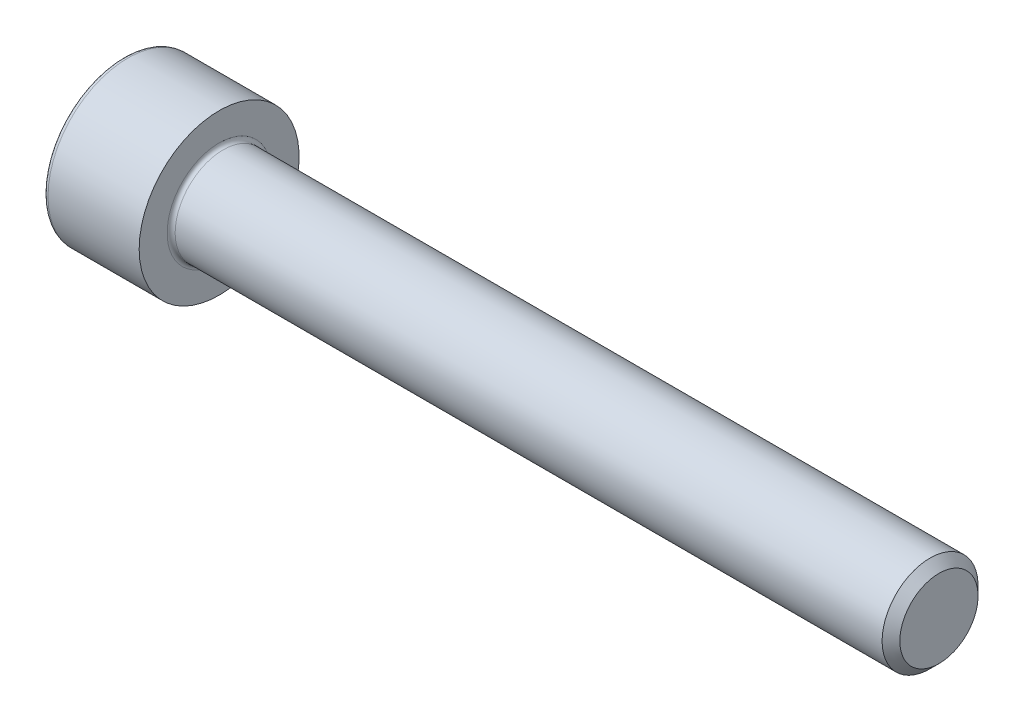
ISO-10303-21;
HEADER;
FILE_DESCRIPTION(('STEP AP214'),'2;1');
FILE_NAME('part.step','',(''),(''),'','','');
FILE_SCHEMA(('AUTOMOTIVE_DESIGN { 1 0 10303 214 1 1 1 1 }'));
ENDSEC;
DATA;
#1=APPLICATION_CONTEXT('core data for automotive mechanical design processes');
#2=APPLICATION_PROTOCOL_DEFINITION('international standard','automotive_design',2000,#1);
#3=PRODUCT_CONTEXT('',#1,'mechanical');
#4=PRODUCT('Part','Part','',(#3));
#5=PRODUCT_RELATED_PRODUCT_CATEGORY('part','',(#4));
#6=PRODUCT_DEFINITION_FORMATION('','',#4);
#7=PRODUCT_DEFINITION_CONTEXT('part definition',#1,'design');
#8=PRODUCT_DEFINITION('design','',#6,#7);
#9=PRODUCT_DEFINITION_SHAPE('','',#8);
#10=(LENGTH_UNIT() NAMED_UNIT(*) SI_UNIT(.MILLI.,.METRE.));
#11=(NAMED_UNIT(*) PLANE_ANGLE_UNIT() SI_UNIT($,.RADIAN.));
#12=(NAMED_UNIT(*) SI_UNIT($,.STERADIAN.) SOLID_ANGLE_UNIT());
#13=UNCERTAINTY_MEASURE_WITH_UNIT(LENGTH_MEASURE(1.E-05),#10,'distance_accuracy_value','');
#14=(GEOMETRIC_REPRESENTATION_CONTEXT(3) GLOBAL_UNCERTAINTY_ASSIGNED_CONTEXT((#13)) GLOBAL_UNIT_ASSIGNED_CONTEXT((#10,
#11,#12)) REPRESENTATION_CONTEXT('',''));
#15=CARTESIAN_POINT('',(0.,0.,0.));
#16=DIRECTION('',(0.,0.,1.));
#17=DIRECTION('',(1.,0.,0.));
#18=AXIS2_PLACEMENT_3D('',#15,#16,#17);
#19=CARTESIAN_POINT('',(0.,0.,0.));
#20=DIRECTION('',(-1.,0.,0.));
#21=DIRECTION('',(0.,0.,1.));
#22=AXIS2_PLACEMENT_3D('',#19,#20,#21);
#23=PLANE('',#22);
#24=DIRECTION('',(0.,-0.499999999999999,0.866025403784439));
#25=VECTOR('',#24,1.);
#26=CARTESIAN_POINT('',(0.,2.93524876856005,0.));
#27=LINE('',#26,#25);
#28=CARTESIAN_POINT('',(0.,2.93524876856005,0.));
#29=VERTEX_POINT('',#28);
#30=CARTESIAN_POINT('',(0.,1.46762438428003,2.54199999999999));
#31=VERTEX_POINT('',#30);
#32=EDGE_CURVE('E259',#29,#31,#27,.T.);
#33=ORIENTED_EDGE('',*,*,#32,.T.);
#34=DIRECTION('',(0.,1.,0.));
#35=VECTOR('',#34,1.);
#36=CARTESIAN_POINT('',(0.,-1.46762438428003,2.542));
#37=LINE('',#36,#35);
#38=CARTESIAN_POINT('',(0.,-1.46762438428003,2.542));
#39=VERTEX_POINT('',#38);
#40=EDGE_CURVE('E131',#39,#31,#37,.T.);
#41=ORIENTED_EDGE('',*,*,#40,.F.);
#42=DIRECTION('',(0.,-0.500000000000001,-0.866025403784438));
#43=VECTOR('',#42,1.);
#44=CARTESIAN_POINT('',(0.,-1.46762438428003,2.542));
#45=LINE('',#44,#43);
#46=CARTESIAN_POINT('',(0.,-2.93524876856006,0.));
#47=VERTEX_POINT('',#46);
#48=EDGE_CURVE('E262',#39,#47,#45,.T.);
#49=ORIENTED_EDGE('',*,*,#48,.T.);
#50=DIRECTION('',(0.,0.499999999999999,-0.866025403784439));
#51=VECTOR('',#50,1.);
#52=CARTESIAN_POINT('',(0.,-2.93524876856006,0.));
#53=LINE('',#52,#51);
#54=CARTESIAN_POINT('',(0.,-1.46762438428004,-2.542));
#55=VERTEX_POINT('',#54);
#56=EDGE_CURVE('E265',#47,#55,#53,.T.);
#57=ORIENTED_EDGE('',*,*,#56,.T.);
#58=DIRECTION('',(0.,-1.,0.));
#59=VECTOR('',#58,1.);
#60=CARTESIAN_POINT('',(0.,1.46762438428002,-2.54200000000001));
#61=LINE('',#60,#59);
#62=CARTESIAN_POINT('',(0.,1.46762438428002,-2.54200000000001));
#63=VERTEX_POINT('',#62);
#64=EDGE_CURVE('E268',#63,#55,#61,.T.);
#65=ORIENTED_EDGE('',*,*,#64,.F.);
#66=DIRECTION('',(0.,-0.500000000000001,-0.866025403784438));
#67=VECTOR('',#66,1.);
#68=CARTESIAN_POINT('',(0.,2.93524876856005,0.));
#69=LINE('',#68,#67);
#70=EDGE_CURVE('E126',#29,#63,#69,.T.);
#71=ORIENTED_EDGE('',*,*,#70,.F.);
#72=EDGE_LOOP('',(#33,#41,#49,#57,#65,#71));
#73=FACE_BOUND('',#72,.T.);
#74=CARTESIAN_POINT('',(0.,0.,0.));
#75=DIRECTION('',(-1.,0.,0.));
#76=DIRECTION('',(0.,0.,1.));
#77=AXIS2_PLACEMENT_3D('',#74,#75,#76);
#78=CIRCLE('',#77,4.7);
#79=CARTESIAN_POINT('',(0.,0.,4.7));
#80=VERTEX_POINT('',#79);
#81=EDGE_CURVE('E43',#80,#80,#78,.T.);
#82=ORIENTED_EDGE('',*,*,#81,.T.);
#83=EDGE_LOOP('',(#82));
#84=FACE_BOUND('',#83,.T.);
#85=ADVANCED_FACE('F35',(#73,#84),#23,.T.);
#86=CARTESIAN_POINT('',(-31.75,0.,0.));
#87=DIRECTION('',(-1.,0.,0.));
#88=DIRECTION('',(0.,0.,1.));
#89=AXIS2_PLACEMENT_3D('',#86,#87,#88);
#90=CYLINDRICAL_SURFACE('',#89,5.);
#91=CARTESIAN_POINT('',(0.300000000000002,0.,0.));
#92=DIRECTION('',(-1.,0.,0.));
#93=DIRECTION('',(0.,0.,1.));
#94=AXIS2_PLACEMENT_3D('',#91,#92,#93);
#95=CIRCLE('',#94,5.);
#96=CARTESIAN_POINT('',(0.300000000000002,0.,5.));
#97=VERTEX_POINT('',#96);
#98=EDGE_CURVE('E11',#97,#97,#95,.F.);
#99=ORIENTED_EDGE('',*,*,#98,.T.);
#100=EDGE_LOOP('',(#99));
#101=FACE_BOUND('',#100,.T.);
#102=CARTESIAN_POINT('',(6.,0.,0.));
#103=DIRECTION('',(-1.,0.,0.));
#104=DIRECTION('',(0.,0.,1.));
#105=AXIS2_PLACEMENT_3D('',#102,#103,#104);
#106=CIRCLE('',#105,5.);
#107=CARTESIAN_POINT('',(6.,0.,5.));
#108=VERTEX_POINT('',#107);
#109=EDGE_CURVE('E149',#108,#108,#106,.T.);
#110=ORIENTED_EDGE('',*,*,#109,.T.);
#111=EDGE_LOOP('',(#110));
#112=FACE_BOUND('',#111,.T.);
#113=ADVANCED_FACE('F173',(#101,#112),#90,.T.);
#114=CARTESIAN_POINT('',(6.,5.,0.));
#115=DIRECTION('',(1.,0.,0.));
#116=DIRECTION('',(0.,0.,-1.));
#117=AXIS2_PLACEMENT_3D('',#114,#115,#116);
#118=PLANE('',#117);
#119=CARTESIAN_POINT('',(6.,0.,0.));
#120=DIRECTION('',(1.,0.,0.));
#121=DIRECTION('',(0.,0.,-1.));
#122=AXIS2_PLACEMENT_3D('',#119,#120,#121);
#123=CIRCLE('',#122,3.24999999999997);
#124=CARTESIAN_POINT('',(6.,0.,-3.24999999999997));
#125=VERTEX_POINT('',#124);
#126=EDGE_CURVE('E152',#125,#125,#123,.F.);
#127=ORIENTED_EDGE('',*,*,#126,.T.);
#128=EDGE_LOOP('',(#127));
#129=FACE_BOUND('',#128,.T.);
#130=ORIENTED_EDGE('',*,*,#109,.F.);
#131=EDGE_LOOP('',(#130));
#132=FACE_BOUND('',#131,.T.);
#133=ADVANCED_FACE('F179',(#129,#132),#118,.T.);
#134=CARTESIAN_POINT('',(-31.75,0.,0.));
#135=DIRECTION('',(-1.,0.,0.));
#136=DIRECTION('',(0.,0.,1.));
#137=AXIS2_PLACEMENT_3D('',#134,#135,#136);
#138=CYLINDRICAL_SURFACE('',#137,2.99999999999997);
#139=CARTESIAN_POINT('',(6.25,0.,0.));
#140=DIRECTION('',(1.,0.,0.));
#141=DIRECTION('',(0.,0.,-1.));
#142=AXIS2_PLACEMENT_3D('',#139,#140,#141);
#143=CIRCLE('',#142,2.99999999999997);
#144=CARTESIAN_POINT('',(6.25,0.,-2.99999999999997));
#145=VERTEX_POINT('',#144);
#146=EDGE_CURVE('E155',#145,#145,#143,.T.);
#147=ORIENTED_EDGE('',*,*,#146,.T.);
#148=EDGE_LOOP('',(#147));
#149=FACE_BOUND('',#148,.T.);
#150=CARTESIAN_POINT('',(50.4454999999999,0.,0.));
#151=DIRECTION('',(-1.,0.,0.));
#152=DIRECTION('',(0.,0.,1.));
#153=AXIS2_PLACEMENT_3D('',#150,#151,#152);
#154=CIRCLE('',#153,2.99999999999995);
#155=CARTESIAN_POINT('',(50.4454999999999,0.,2.99999999999995));
#156=VERTEX_POINT('',#155);
#157=EDGE_CURVE('E146',#156,#156,#154,.T.);
#158=ORIENTED_EDGE('',*,*,#157,.T.);
#159=EDGE_LOOP('',(#158));
#160=FACE_BOUND('',#159,.T.);
#161=ADVANCED_FACE('F185',(#149,#160),#138,.T.);
#162=CARTESIAN_POINT('',(51.,0.,0.));
#163=DIRECTION('',(-1.,0.,0.));
#164=DIRECTION('',(0.,0.,1.));
#165=AXIS2_PLACEMENT_3D('',#162,#163,#164);
#166=CONICAL_SURFACE('',#165,2.4455,0.78539816339735);
#167=ORIENTED_EDGE('',*,*,#157,.F.);
#168=EDGE_LOOP('',(#167));
#169=FACE_BOUND('',#168,.T.);
#170=CARTESIAN_POINT('',(51.,0.,0.));
#171=DIRECTION('',(-1.,0.,0.));
#172=DIRECTION('',(0.,0.,1.));
#173=AXIS2_PLACEMENT_3D('',#170,#171,#172);
#174=CIRCLE('',#173,2.4455);
#175=CARTESIAN_POINT('',(51.,0.,2.4455));
#176=VERTEX_POINT('',#175);
#177=EDGE_CURVE('E142',#176,#176,#174,.T.);
#178=ORIENTED_EDGE('',*,*,#177,.T.);
#179=EDGE_LOOP('',(#178));
#180=FACE_BOUND('',#179,.T.);
#181=ADVANCED_FACE('F189',(#169,#180),#166,.T.);
#182=CARTESIAN_POINT('',(51.,2.4455,0.));
#183=DIRECTION('',(1.,0.,0.));
#184=DIRECTION('',(0.,0.,-1.));
#185=AXIS2_PLACEMENT_3D('',#182,#183,#184);
#186=PLANE('',#185);
#187=ORIENTED_EDGE('',*,*,#177,.F.);
#188=EDGE_LOOP('',(#187));
#189=FACE_BOUND('',#188,.T.);
#190=ADVANCED_FACE('F169',(#189),#186,.T.);
#191=CARTESIAN_POINT('',(6.25,0.,0.));
#192=DIRECTION('',(1.,0.,0.));
#193=DIRECTION('',(0.,0.,-1.));
#194=AXIS2_PLACEMENT_3D('',#191,#192,#193);
#195=TOROIDAL_SURFACE('',#194,3.24999999999997,0.25);
#196=ORIENTED_EDGE('',*,*,#146,.F.);
#197=EDGE_LOOP('',(#196));
#198=FACE_BOUND('',#197,.T.);
#199=ORIENTED_EDGE('',*,*,#126,.F.);
#200=EDGE_LOOP('',(#199));
#201=FACE_BOUND('',#200,.T.);
#202=ADVANCED_FACE('F162',(#198,#201),#195,.F.);
#203=CARTESIAN_POINT('',(0.300000000000002,0.,0.));
#204=DIRECTION('',(-1.,0.,0.));
#205=DIRECTION('',(0.,0.,1.));
#206=AXIS2_PLACEMENT_3D('',#203,#204,#205);
#207=TOROIDAL_SURFACE('',#206,4.7,0.3);
#208=ORIENTED_EDGE('',*,*,#98,.F.);
#209=EDGE_LOOP('',(#208));
#210=FACE_BOUND('',#209,.T.);
#211=ORIENTED_EDGE('',*,*,#81,.F.);
#212=EDGE_LOOP('',(#211));
#213=FACE_BOUND('',#212,.T.);
#214=ADVANCED_FACE('F37',(#210,#213),#207,.T.);
#215=CARTESIAN_POINT('',(3.,2.93524876856005,0.));
#216=DIRECTION('',(0.,-0.866025403784439,-0.499999999999999));
#217=DIRECTION('',(0.,0.499999999999999,-0.866025403784439));
#218=AXIS2_PLACEMENT_3D('',#215,#216,#217);
#219=PLANE('',#218);
#220=ORIENTED_EDGE('',*,*,#32,.F.);
#221=DIRECTION('',(-1.,0.,0.));
#222=VECTOR('',#221,1.);
#223=CARTESIAN_POINT('',(3.,2.93524876856005,0.));
#224=LINE('',#223,#222);
#225=CARTESIAN_POINT('',(3.,2.93524876856005,0.));
#226=VERTEX_POINT('',#225);
#227=EDGE_CURVE('E249',#226,#29,#224,.T.);
#228=ORIENTED_EDGE('',*,*,#227,.F.);
#229=DIRECTION('',(0.,-0.499999999999999,0.866025403784439));
#230=VECTOR('',#229,1.);
#231=CARTESIAN_POINT('',(3.,2.93524876856005,0.));
#232=LINE('',#231,#230);
#233=CARTESIAN_POINT('',(3.,2.20143657642004,1.27099999999999));
#234=VERTEX_POINT('',#233);
#235=EDGE_CURVE('E118',#226,#234,#232,.T.);
#236=ORIENTED_EDGE('',*,*,#235,.T.);
#237=CARTESIAN_POINT('',(3.,1.46762438428003,2.54199999999999));
#238=VERTEX_POINT('',#237);
#239=EDGE_CURVE('E109',#234,#238,#232,.T.);
#240=ORIENTED_EDGE('',*,*,#239,.T.);
#241=DIRECTION('',(-1.,0.,0.));
#242=VECTOR('',#241,1.);
#243=CARTESIAN_POINT('',(3.,1.46762438428003,2.54199999999999));
#244=LINE('',#243,#242);
#245=EDGE_CURVE('E123',#238,#31,#244,.T.);
#246=ORIENTED_EDGE('',*,*,#245,.T.);
#247=EDGE_LOOP('',(#220,#228,#236,#240,#246));
#248=FACE_BOUND('',#247,.T.);
#249=ADVANCED_FACE('F122',(#248),#219,.T.);
#250=CARTESIAN_POINT('',(3.,-1.46762438428003,2.542));
#251=DIRECTION('',(0.,0.,1.));
#252=DIRECTION('',(0.,-1.,0.));
#253=AXIS2_PLACEMENT_3D('',#250,#251,#252);
#254=PLANE('',#253);
#255=ORIENTED_EDGE('',*,*,#40,.T.);
#256=ORIENTED_EDGE('',*,*,#245,.F.);
#257=DIRECTION('',(0.,1.,0.));
#258=VECTOR('',#257,1.);
#259=CARTESIAN_POINT('',(3.,-1.46762438428003,2.542));
#260=LINE('',#259,#258);
#261=CARTESIAN_POINT('',(3.,0.,2.54199999999999));
#262=VERTEX_POINT('',#261);
#263=EDGE_CURVE('E106',#262,#238,#260,.T.);
#264=ORIENTED_EDGE('',*,*,#263,.F.);
#265=CARTESIAN_POINT('',(3.,-1.46762438428003,2.542));
#266=VERTEX_POINT('',#265);
#267=EDGE_CURVE('E117',#266,#262,#260,.T.);
#268=ORIENTED_EDGE('',*,*,#267,.F.);
#269=DIRECTION('',(-1.,0.,0.));
#270=VECTOR('',#269,1.);
#271=CARTESIAN_POINT('',(3.,-1.46762438428003,2.542));
#272=LINE('',#271,#270);
#273=EDGE_CURVE('E133',#266,#39,#272,.T.);
#274=ORIENTED_EDGE('',*,*,#273,.T.);
#275=EDGE_LOOP('',(#255,#256,#264,#268,#274));
#276=FACE_BOUND('',#275,.T.);
#277=ADVANCED_FACE('F128',(#276),#254,.F.);
#278=CARTESIAN_POINT('',(3.,-1.46762438428003,2.542));
#279=DIRECTION('',(0.,0.866025403784438,-0.500000000000001));
#280=DIRECTION('',(0.,0.500000000000001,0.866025403784438));
#281=AXIS2_PLACEMENT_3D('',#278,#279,#280);
#282=PLANE('',#281);
#283=ORIENTED_EDGE('',*,*,#48,.F.);
#284=ORIENTED_EDGE('',*,*,#273,.F.);
#285=DIRECTION('',(0.,-0.500000000000001,-0.866025403784438));
#286=VECTOR('',#285,1.);
#287=CARTESIAN_POINT('',(3.,-1.46762438428003,2.542));
#288=LINE('',#287,#286);
#289=CARTESIAN_POINT('',(3.,-2.20143657642004,1.271));
#290=VERTEX_POINT('',#289);
#291=EDGE_CURVE('E288',#266,#290,#288,.T.);
#292=ORIENTED_EDGE('',*,*,#291,.T.);
#293=CARTESIAN_POINT('',(3.,-2.93524876856006,0.));
#294=VERTEX_POINT('',#293);
#295=EDGE_CURVE('E277',#290,#294,#288,.T.);
#296=ORIENTED_EDGE('',*,*,#295,.T.);
#297=DIRECTION('',(-1.,0.,0.));
#298=VECTOR('',#297,1.);
#299=CARTESIAN_POINT('',(3.,-2.93524876856006,0.));
#300=LINE('',#299,#298);
#301=EDGE_CURVE('E138',#294,#47,#300,.T.);
#302=ORIENTED_EDGE('',*,*,#301,.T.);
#303=EDGE_LOOP('',(#283,#284,#292,#296,#302));
#304=FACE_BOUND('',#303,.T.);
#305=ADVANCED_FACE('F203',(#304),#282,.T.);
#306=CARTESIAN_POINT('',(3.,-2.93524876856006,0.));
#307=DIRECTION('',(0.,0.866025403784439,0.499999999999999));
#308=DIRECTION('',(0.,-0.499999999999999,0.866025403784439));
#309=AXIS2_PLACEMENT_3D('',#306,#307,#308);
#310=PLANE('',#309);
#311=ORIENTED_EDGE('',*,*,#56,.F.);
#312=ORIENTED_EDGE('',*,*,#301,.F.);
#313=DIRECTION('',(0.,0.499999999999999,-0.866025403784439));
#314=VECTOR('',#313,1.);
#315=CARTESIAN_POINT('',(3.,-2.93524876856006,0.));
#316=LINE('',#315,#314);
#317=CARTESIAN_POINT('',(3.,-2.20143657642005,-1.271));
#318=VERTEX_POINT('',#317);
#319=EDGE_CURVE('E255',#294,#318,#316,.T.);
#320=ORIENTED_EDGE('',*,*,#319,.T.);
#321=CARTESIAN_POINT('',(3.,-1.46762438428004,-2.542));
#322=VERTEX_POINT('',#321);
#323=EDGE_CURVE('E287',#318,#322,#316,.T.);
#324=ORIENTED_EDGE('',*,*,#323,.T.);
#325=DIRECTION('',(-1.,0.,0.));
#326=VECTOR('',#325,1.);
#327=CARTESIAN_POINT('',(3.,-1.46762438428004,-2.542));
#328=LINE('',#327,#326);
#329=EDGE_CURVE('E248',#322,#55,#328,.T.);
#330=ORIENTED_EDGE('',*,*,#329,.T.);
#331=EDGE_LOOP('',(#311,#312,#320,#324,#330));
#332=FACE_BOUND('',#331,.T.);
#333=ADVANCED_FACE('F206',(#332),#310,.T.);
#334=CARTESIAN_POINT('',(3.,1.46762438428002,-2.54200000000001));
#335=DIRECTION('',(0.,0.,-1.));
#336=DIRECTION('',(0.,1.,0.));
#337=AXIS2_PLACEMENT_3D('',#334,#335,#336);
#338=PLANE('',#337);
#339=ORIENTED_EDGE('',*,*,#64,.T.);
#340=ORIENTED_EDGE('',*,*,#329,.F.);
#341=DIRECTION('',(0.,-1.,0.));
#342=VECTOR('',#341,1.);
#343=CARTESIAN_POINT('',(3.,1.46762438428002,-2.54200000000001));
#344=LINE('',#343,#342);
#345=CARTESIAN_POINT('',(3.,0.,-2.542));
#346=VERTEX_POINT('',#345);
#347=EDGE_CURVE('E252',#346,#322,#344,.T.);
#348=ORIENTED_EDGE('',*,*,#347,.F.);
#349=CARTESIAN_POINT('',(3.,1.46762438428002,-2.54200000000001));
#350=VERTEX_POINT('',#349);
#351=EDGE_CURVE('E50',#350,#346,#344,.T.);
#352=ORIENTED_EDGE('',*,*,#351,.F.);
#353=DIRECTION('',(-1.,0.,0.));
#354=VECTOR('',#353,1.);
#355=CARTESIAN_POINT('',(3.,1.46762438428002,-2.54200000000001));
#356=LINE('',#355,#354);
#357=EDGE_CURVE('E245',#350,#63,#356,.T.);
#358=ORIENTED_EDGE('',*,*,#357,.T.);
#359=EDGE_LOOP('',(#339,#340,#348,#352,#358));
#360=FACE_BOUND('',#359,.T.);
#361=ADVANCED_FACE('F210',(#360),#338,.F.);
#362=CARTESIAN_POINT('',(3.,2.93524876856005,0.));
#363=DIRECTION('',(0.,0.866025403784438,-0.500000000000001));
#364=DIRECTION('',(0.,0.500000000000001,0.866025403784438));
#365=AXIS2_PLACEMENT_3D('',#362,#363,#364);
#366=PLANE('',#365);
#367=ORIENTED_EDGE('',*,*,#70,.T.);
#368=ORIENTED_EDGE('',*,*,#357,.F.);
#369=DIRECTION('',(0.,-0.500000000000001,-0.866025403784438));
#370=VECTOR('',#369,1.);
#371=CARTESIAN_POINT('',(3.,2.93524876856005,0.));
#372=LINE('',#371,#370);
#373=CARTESIAN_POINT('',(3.,2.20143657642004,-1.271));
#374=VERTEX_POINT('',#373);
#375=EDGE_CURVE('E235',#374,#350,#372,.T.);
#376=ORIENTED_EDGE('',*,*,#375,.F.);
#377=EDGE_CURVE('E241',#226,#374,#372,.T.);
#378=ORIENTED_EDGE('',*,*,#377,.F.);
#379=ORIENTED_EDGE('',*,*,#227,.T.);
#380=EDGE_LOOP('',(#367,#368,#376,#378,#379));
#381=FACE_BOUND('',#380,.T.);
#382=ADVANCED_FACE('F214',(#381),#366,.F.);
#383=CARTESIAN_POINT('',(3.,2.93524876856005,0.));
#384=DIRECTION('',(1.,0.,0.));
#385=DIRECTION('',(0.,0.,-1.));
#386=AXIS2_PLACEMENT_3D('',#383,#384,#385);
#387=PLANE('',#386);
#388=ORIENTED_EDGE('',*,*,#347,.T.);
#389=ORIENTED_EDGE('',*,*,#323,.F.);
#390=CARTESIAN_POINT('',(3.,0.,0.));
#391=DIRECTION('',(-1.,0.,0.));
#392=DIRECTION('',(0.,0.,1.));
#393=AXIS2_PLACEMENT_3D('',#390,#391,#392);
#394=CIRCLE('',#393,2.542);
#395=EDGE_CURVE('E283',#346,#318,#394,.T.);
#396=ORIENTED_EDGE('',*,*,#395,.F.);
#397=EDGE_LOOP('',(#388,#389,#396));
#398=FACE_BOUND('',#397,.T.);
#399=ADVANCED_FACE('F218',(#398),#387,.F.);
#400=ORIENTED_EDGE('',*,*,#319,.F.);
#401=ORIENTED_EDGE('',*,*,#295,.F.);
#402=EDGE_CURVE('E136',#318,#290,#394,.T.);
#403=ORIENTED_EDGE('',*,*,#402,.F.);
#404=EDGE_LOOP('',(#400,#401,#403));
#405=FACE_BOUND('',#404,.T.);
#406=ADVANCED_FACE('F221',(#405),#387,.F.);
#407=ORIENTED_EDGE('',*,*,#291,.F.);
#408=ORIENTED_EDGE('',*,*,#267,.T.);
#409=EDGE_CURVE('E132',#290,#262,#394,.T.);
#410=ORIENTED_EDGE('',*,*,#409,.F.);
#411=EDGE_LOOP('',(#407,#408,#410));
#412=FACE_BOUND('',#411,.T.);
#413=ADVANCED_FACE('F226',(#412),#387,.F.);
#414=ORIENTED_EDGE('',*,*,#263,.T.);
#415=ORIENTED_EDGE('',*,*,#239,.F.);
#416=EDGE_CURVE('E112',#262,#234,#394,.T.);
#417=ORIENTED_EDGE('',*,*,#416,.F.);
#418=EDGE_LOOP('',(#414,#415,#417));
#419=FACE_BOUND('',#418,.T.);
#420=ADVANCED_FACE('F108',(#419),#387,.F.);
#421=ORIENTED_EDGE('',*,*,#235,.F.);
#422=ORIENTED_EDGE('',*,*,#377,.T.);
#423=EDGE_CURVE('E143',#234,#374,#394,.T.);
#424=ORIENTED_EDGE('',*,*,#423,.F.);
#425=EDGE_LOOP('',(#421,#422,#424));
#426=FACE_BOUND('',#425,.T.);
#427=ADVANCED_FACE('F229',(#426),#387,.F.);
#428=ORIENTED_EDGE('',*,*,#375,.T.);
#429=ORIENTED_EDGE('',*,*,#351,.T.);
#430=EDGE_CURVE('E238',#374,#346,#394,.T.);
#431=ORIENTED_EDGE('',*,*,#430,.F.);
#432=EDGE_LOOP('',(#428,#429,#431));
#433=FACE_BOUND('',#432,.T.);
#434=ADVANCED_FACE('F199',(#433),#387,.F.);
#435=CARTESIAN_POINT('',(3.,0.,0.));
#436=DIRECTION('',(-1.,0.,0.));
#437=DIRECTION('',(0.,0.,1.));
#438=AXIS2_PLACEMENT_3D('',#435,#436,#437);
#439=CONICAL_SURFACE('',#438,2.542,1.04719755119659);
#440=CARTESIAN_POINT('',(4.46762438428005,0.,0.));
#441=VERTEX_POINT('',#440);
#442=VERTEX_LOOP('',#441);
#443=FACE_BOUND('',#442,.T.);
#444=ORIENTED_EDGE('',*,*,#416,.T.);
#445=ORIENTED_EDGE('',*,*,#423,.T.);
#446=ORIENTED_EDGE('',*,*,#430,.T.);
#447=ORIENTED_EDGE('',*,*,#395,.T.);
#448=ORIENTED_EDGE('',*,*,#402,.T.);
#449=ORIENTED_EDGE('',*,*,#409,.T.);
#450=EDGE_LOOP('',(#444,#445,#446,#447,#448,#449));
#451=FACE_BOUND('',#450,.T.);
#452=ADVANCED_FACE('F197',(#443,#451),#439,.F.);
#453=CLOSED_SHELL('',(#85,#113,#133,#161,#181,#190,#202,#214,#249,#277,#305,#333,#361,#382,#399,
#406,#413,#420,#427,#434,#452));
#454=MANIFOLD_SOLID_BREP('B2',#453);
#455=ADVANCED_BREP_SHAPE_REPRESENTATION('',(#18,#454),#14);
#456=SHAPE_DEFINITION_REPRESENTATION(#9,#455);
ENDSEC;
END-ISO-10303-21;
